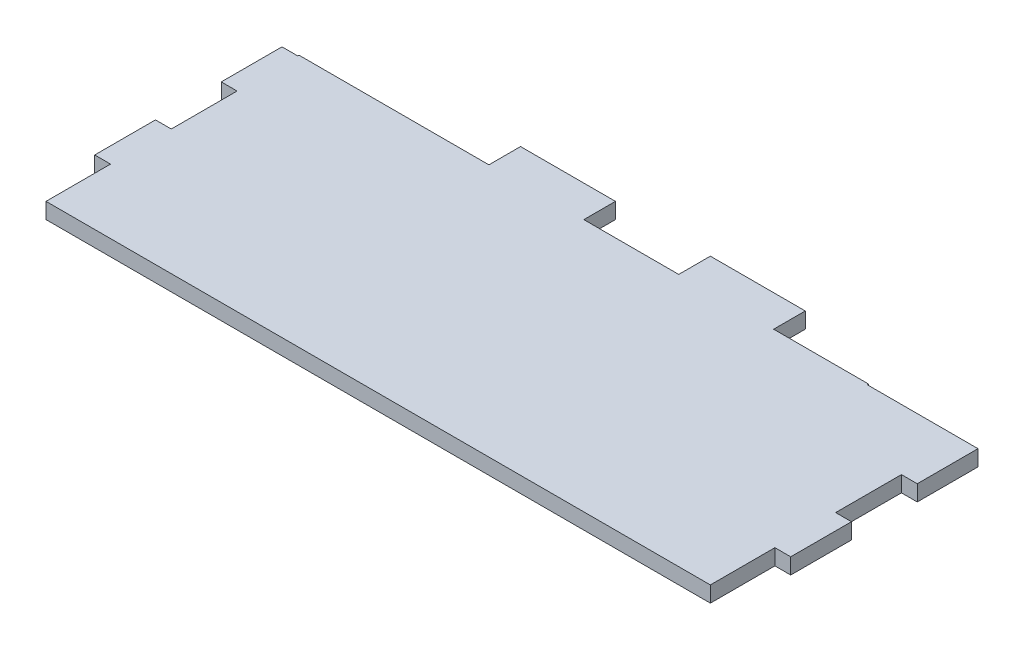
ISO-10303-21;
HEADER;
FILE_DESCRIPTION(('STEP AP214'),'2;1');
FILE_NAME('part.step','',(''),(''),'','','');
FILE_SCHEMA(('AUTOMOTIVE_DESIGN { 1 0 10303 214 1 1 1 1 }'));
ENDSEC;
DATA;
#1=APPLICATION_CONTEXT('core data for automotive mechanical design processes');
#2=APPLICATION_PROTOCOL_DEFINITION('international standard','automotive_design',2000,#1);
#3=PRODUCT_CONTEXT('',#1,'mechanical');
#4=PRODUCT('Part','Part','',(#3));
#5=PRODUCT_RELATED_PRODUCT_CATEGORY('part','',(#4));
#6=PRODUCT_DEFINITION_FORMATION('','',#4);
#7=PRODUCT_DEFINITION_CONTEXT('part definition',#1,'design');
#8=PRODUCT_DEFINITION('design','',#6,#7);
#9=PRODUCT_DEFINITION_SHAPE('','',#8);
#10=(LENGTH_UNIT() NAMED_UNIT(*) SI_UNIT(.MILLI.,.METRE.));
#11=(NAMED_UNIT(*) PLANE_ANGLE_UNIT() SI_UNIT($,.RADIAN.));
#12=(NAMED_UNIT(*) SI_UNIT($,.STERADIAN.) SOLID_ANGLE_UNIT());
#13=UNCERTAINTY_MEASURE_WITH_UNIT(LENGTH_MEASURE(1.E-05),#10,'distance_accuracy_value','');
#14=(GEOMETRIC_REPRESENTATION_CONTEXT(3) GLOBAL_UNCERTAINTY_ASSIGNED_CONTEXT((#13)) GLOBAL_UNIT_ASSIGNED_CONTEXT((#10,
#11,#12)) REPRESENTATION_CONTEXT('',''));
#15=CARTESIAN_POINT('',(0.,0.,0.));
#16=DIRECTION('',(0.,0.,1.));
#17=DIRECTION('',(1.,0.,0.));
#18=AXIS2_PLACEMENT_3D('',#15,#16,#17);
#19=CARTESIAN_POINT('',(0.,3.175,0.));
#20=DIRECTION('',(0.,-1.,0.));
#21=DIRECTION('',(0.,0.,-1.));
#22=AXIS2_PLACEMENT_3D('',#19,#20,#21);
#23=PLANE('',#22);
#24=DIRECTION('',(-1.,0.,0.));
#25=VECTOR('',#24,1.);
#26=CARTESIAN_POINT('',(-97.10973789192,3.175,0.));
#27=LINE('',#26,#25);
#28=CARTESIAN_POINT('',(66.675,3.175,0.));
#29=VERTEX_POINT('',#28);
#30=CARTESIAN_POINT('',(-66.675,3.175,0.));
#31=VERTEX_POINT('',#30);
#32=EDGE_CURVE('E51',#29,#31,#27,.T.);
#33=ORIENTED_EDGE('',*,*,#32,.F.);
#34=DIRECTION('',(0.,0.,-1.));
#35=VECTOR('',#34,1.);
#36=CARTESIAN_POINT('',(66.675,3.175,50.8));
#37=LINE('',#36,#35);
#38=CARTESIAN_POINT('',(66.675,3.175,-12.954));
#39=VERTEX_POINT('',#38);
#40=EDGE_CURVE('E233',#29,#39,#37,.T.);
#41=ORIENTED_EDGE('',*,*,#40,.T.);
#42=DIRECTION('',(-1.,0.,0.));
#43=VECTOR('',#42,1.);
#44=CARTESIAN_POINT('',(66.6749999999998,3.175,-12.954));
#45=LINE('',#44,#43);
#46=CARTESIAN_POINT('',(69.8499999999998,3.175,-12.954));
#47=VERTEX_POINT('',#46);
#48=EDGE_CURVE('E396',#47,#39,#45,.T.);
#49=ORIENTED_EDGE('',*,*,#48,.F.);
#50=DIRECTION('',(0.,0.,1.));
#51=VECTOR('',#50,1.);
#52=CARTESIAN_POINT('',(69.8499999999998,3.175,-12.954));
#53=LINE('',#52,#51);
#54=CARTESIAN_POINT('',(69.8499999999998,3.175,-25.146));
#55=VERTEX_POINT('',#54);
#56=EDGE_CURVE('E388',#55,#47,#53,.T.);
#57=ORIENTED_EDGE('',*,*,#56,.F.);
#58=DIRECTION('',(1.,0.,0.));
#59=VECTOR('',#58,1.);
#60=CARTESIAN_POINT('',(66.6749999999998,3.175,-25.146));
#61=LINE('',#60,#59);
#62=CARTESIAN_POINT('',(66.675,3.175,-25.146));
#63=VERTEX_POINT('',#62);
#64=EDGE_CURVE('E404',#63,#55,#61,.T.);
#65=ORIENTED_EDGE('',*,*,#64,.F.);
#66=CARTESIAN_POINT('',(66.6749999999997,3.175,-38.354));
#67=VERTEX_POINT('',#66);
#68=EDGE_CURVE('E252',#63,#67,#37,.T.);
#69=ORIENTED_EDGE('',*,*,#68,.T.);
#70=DIRECTION('',(-1.,0.,0.));
#71=VECTOR('',#70,1.);
#72=CARTESIAN_POINT('',(66.6749999999997,3.175,-38.354));
#73=LINE('',#72,#71);
#74=CARTESIAN_POINT('',(69.8499999999997,3.175,-38.354));
#75=VERTEX_POINT('',#74);
#76=EDGE_CURVE('E370',#75,#67,#73,.T.);
#77=ORIENTED_EDGE('',*,*,#76,.F.);
#78=DIRECTION('',(0.,0.,1.));
#79=VECTOR('',#78,1.);
#80=CARTESIAN_POINT('',(69.8499999999997,3.175,-38.354));
#81=LINE('',#80,#79);
#82=CARTESIAN_POINT('',(69.8499999999997,3.175,-50.546));
#83=VERTEX_POINT('',#82);
#84=EDGE_CURVE('E364',#83,#75,#81,.T.);
#85=ORIENTED_EDGE('',*,*,#84,.F.);
#86=DIRECTION('',(1.,0.,0.));
#87=VECTOR('',#86,1.);
#88=CARTESIAN_POINT('',(66.6749999999997,3.175,-50.546));
#89=LINE('',#88,#87);
#90=CARTESIAN_POINT('',(47.625,3.175,-50.546));
#91=VERTEX_POINT('',#90);
#92=EDGE_CURVE('E380',#91,#83,#89,.T.);
#93=ORIENTED_EDGE('',*,*,#92,.F.);
#94=DIRECTION('',(0.,0.,1.));
#95=VECTOR('',#94,1.);
#96=CARTESIAN_POINT('',(47.625,3.175,-57.1499999999992));
#97=LINE('',#96,#95);
#98=CARTESIAN_POINT('',(47.625,3.175,-50.7999999999992));
#99=VERTEX_POINT('',#98);
#100=EDGE_CURVE('E464',#99,#91,#97,.T.);
#101=ORIENTED_EDGE('',*,*,#100,.F.);
#102=DIRECTION('',(-1.,0.,0.));
#103=VECTOR('',#102,1.);
#104=CARTESIAN_POINT('',(-66.675,3.175,-50.8));
#105=LINE('',#104,#103);
#106=CARTESIAN_POINT('',(28.575,3.175,-50.8));
#107=VERTEX_POINT('',#106);
#108=EDGE_CURVE('E294',#99,#107,#105,.T.);
#109=ORIENTED_EDGE('',*,*,#108,.T.);
#110=DIRECTION('',(0.,0.,1.));
#111=VECTOR('',#110,1.);
#112=CARTESIAN_POINT('',(28.575,3.175,-50.7999999999995));
#113=LINE('',#112,#111);
#114=CARTESIAN_POINT('',(28.575,3.175,-57.1499999999995));
#115=VERTEX_POINT('',#114);
#116=EDGE_CURVE('E437',#115,#107,#113,.T.);
#117=ORIENTED_EDGE('',*,*,#116,.F.);
#118=DIRECTION('',(1.,0.,0.));
#119=VECTOR('',#118,1.);
#120=CARTESIAN_POINT('',(9.52500000000001,3.175,-57.1499999999995));
#121=LINE('',#120,#119);
#122=CARTESIAN_POINT('',(9.52500000000001,3.175,-57.1499999999995));
#123=VERTEX_POINT('',#122);
#124=EDGE_CURVE('E455',#123,#115,#121,.T.);
#125=ORIENTED_EDGE('',*,*,#124,.F.);
#126=DIRECTION('',(0.,0.,-1.));
#127=VECTOR('',#126,1.);
#128=CARTESIAN_POINT('',(9.52500000000001,3.175,-50.7999999999995));
#129=LINE('',#128,#127);
#130=CARTESIAN_POINT('',(9.52500000000001,3.175,-50.8));
#131=VERTEX_POINT('',#130);
#132=EDGE_CURVE('E446',#131,#123,#129,.T.);
#133=ORIENTED_EDGE('',*,*,#132,.F.);
#134=CARTESIAN_POINT('',(-9.525,3.175,-50.8));
#135=VERTEX_POINT('',#134);
#136=EDGE_CURVE('E59',#131,#135,#105,.T.);
#137=ORIENTED_EDGE('',*,*,#136,.T.);
#138=DIRECTION('',(0.,0.,1.));
#139=VECTOR('',#138,1.);
#140=CARTESIAN_POINT('',(-9.525,3.175,-50.7999999999997));
#141=LINE('',#140,#139);
#142=CARTESIAN_POINT('',(-9.525,3.175,-57.1499999999997));
#143=VERTEX_POINT('',#142);
#144=EDGE_CURVE('E412',#143,#135,#141,.T.);
#145=ORIENTED_EDGE('',*,*,#144,.F.);
#146=DIRECTION('',(1.,0.,0.));
#147=VECTOR('',#146,1.);
#148=CARTESIAN_POINT('',(-28.575,3.175,-57.1499999999997));
#149=LINE('',#148,#147);
#150=CARTESIAN_POINT('',(-28.575,3.175,-57.1499999999997));
#151=VERTEX_POINT('',#150);
#152=EDGE_CURVE('E430',#151,#143,#149,.T.);
#153=ORIENTED_EDGE('',*,*,#152,.F.);
#154=DIRECTION('',(0.,0.,-1.));
#155=VECTOR('',#154,1.);
#156=CARTESIAN_POINT('',(-28.575,3.175,-50.7999999999997));
#157=LINE('',#156,#155);
#158=CARTESIAN_POINT('',(-28.575,3.175,-50.8));
#159=VERTEX_POINT('',#158);
#160=EDGE_CURVE('E308',#159,#151,#157,.T.);
#161=ORIENTED_EDGE('',*,*,#160,.F.);
#162=CARTESIAN_POINT('',(-66.675,3.175,-50.8));
#163=VERTEX_POINT('',#162);
#164=EDGE_CURVE('E293',#159,#163,#105,.T.);
#165=ORIENTED_EDGE('',*,*,#164,.T.);
#166=DIRECTION('',(0.,0.,1.));
#167=VECTOR('',#166,1.);
#168=CARTESIAN_POINT('',(-66.675,3.175,50.8));
#169=LINE('',#168,#167);
#170=CARTESIAN_POINT('',(-66.675,3.175,-50.546));
#171=VERTEX_POINT('',#170);
#172=EDGE_CURVE('E45',#163,#171,#169,.T.);
#173=ORIENTED_EDGE('',*,*,#172,.T.);
#174=DIRECTION('',(1.,0.,0.));
#175=VECTOR('',#174,1.);
#176=CARTESIAN_POINT('',(-66.6749999999997,3.175,-50.546));
#177=LINE('',#176,#175);
#178=CARTESIAN_POINT('',(-69.8499999999997,3.175,-50.546));
#179=VERTEX_POINT('',#178);
#180=EDGE_CURVE('E342',#179,#171,#177,.T.);
#181=ORIENTED_EDGE('',*,*,#180,.F.);
#182=DIRECTION('',(0.,0.,-1.));
#183=VECTOR('',#182,1.);
#184=CARTESIAN_POINT('',(-69.8499999999997,3.175,-38.354));
#185=LINE('',#184,#183);
#186=CARTESIAN_POINT('',(-69.8499999999997,3.175,-38.354));
#187=VERTEX_POINT('',#186);
#188=EDGE_CURVE('E356',#187,#179,#185,.T.);
#189=ORIENTED_EDGE('',*,*,#188,.F.);
#190=DIRECTION('',(-1.,0.,0.));
#191=VECTOR('',#190,1.);
#192=CARTESIAN_POINT('',(-66.6749999999997,3.175,-38.354));
#193=LINE('',#192,#191);
#194=CARTESIAN_POINT('',(-66.675,3.175,-38.354));
#195=VERTEX_POINT('',#194);
#196=EDGE_CURVE('E326',#195,#187,#193,.T.);
#197=ORIENTED_EDGE('',*,*,#196,.F.);
#198=CARTESIAN_POINT('',(-66.675,3.175,-25.146));
#199=VERTEX_POINT('',#198);
#200=EDGE_CURVE('E301',#195,#199,#169,.T.);
#201=ORIENTED_EDGE('',*,*,#200,.T.);
#202=DIRECTION('',(1.,0.,0.));
#203=VECTOR('',#202,1.);
#204=CARTESIAN_POINT('',(-66.6749999999998,3.175,-25.146));
#205=LINE('',#204,#203);
#206=CARTESIAN_POINT('',(-69.8499999999998,3.175,-25.146));
#207=VERTEX_POINT('',#206);
#208=EDGE_CURVE('E282',#207,#199,#205,.T.);
#209=ORIENTED_EDGE('',*,*,#208,.F.);
#210=DIRECTION('',(0.,0.,-1.));
#211=VECTOR('',#210,1.);
#212=CARTESIAN_POINT('',(-69.8499999999998,3.175,-12.954));
#213=LINE('',#212,#211);
#214=CARTESIAN_POINT('',(-69.8499999999998,3.175,-12.954));
#215=VERTEX_POINT('',#214);
#216=EDGE_CURVE('E334',#215,#207,#213,.T.);
#217=ORIENTED_EDGE('',*,*,#216,.F.);
#218=DIRECTION('',(-1.,0.,0.));
#219=VECTOR('',#218,1.);
#220=CARTESIAN_POINT('',(-66.6749999999998,3.175,-12.954));
#221=LINE('',#220,#219);
#222=CARTESIAN_POINT('',(-66.675,3.175,-12.954));
#223=VERTEX_POINT('',#222);
#224=EDGE_CURVE('E286',#223,#215,#221,.T.);
#225=ORIENTED_EDGE('',*,*,#224,.F.);
#226=EDGE_CURVE('E295',#223,#31,#169,.T.);
#227=ORIENTED_EDGE('',*,*,#226,.T.);
#228=EDGE_LOOP('',(#33,#41,#49,#57,#65,#69,#77,#85,#93,#101,#109,#117,#125,#133,#137,#145,#153,
#161,#165,#173,#181,#189,#197,#201,#209,#217,#225,#227));
#229=FACE_BOUND('',#228,.T.);
#230=ADVANCED_FACE('F37',(#229),#23,.F.);
#231=CARTESIAN_POINT('',(0.,0.,0.));
#232=DIRECTION('',(0.,-1.,0.));
#233=DIRECTION('',(0.,0.,-1.));
#234=AXIS2_PLACEMENT_3D('',#231,#232,#233);
#235=PLANE('',#234);
#236=DIRECTION('',(0.,0.,-1.));
#237=VECTOR('',#236,1.);
#238=CARTESIAN_POINT('',(66.675,0.,50.8));
#239=LINE('',#238,#237);
#240=CARTESIAN_POINT('',(66.675,0.,0.));
#241=VERTEX_POINT('',#240);
#242=CARTESIAN_POINT('',(66.675,0.,-12.954));
#243=VERTEX_POINT('',#242);
#244=EDGE_CURVE('E231',#241,#243,#239,.T.);
#245=ORIENTED_EDGE('',*,*,#244,.F.);
#246=DIRECTION('',(-1.,0.,0.));
#247=VECTOR('',#246,1.);
#248=CARTESIAN_POINT('',(-97.10973789192,0.,0.));
#249=LINE('',#248,#247);
#250=CARTESIAN_POINT('',(-66.675,0.,0.));
#251=VERTEX_POINT('',#250);
#252=EDGE_CURVE('E220',#241,#251,#249,.T.);
#253=ORIENTED_EDGE('',*,*,#252,.T.);
#254=DIRECTION('',(0.,0.,1.));
#255=VECTOR('',#254,1.);
#256=CARTESIAN_POINT('',(-66.675,0.,50.8));
#257=LINE('',#256,#255);
#258=CARTESIAN_POINT('',(-66.6749999999998,0.,-12.954));
#259=VERTEX_POINT('',#258);
#260=EDGE_CURVE('E250',#259,#251,#257,.T.);
#261=ORIENTED_EDGE('',*,*,#260,.F.);
#262=DIRECTION('',(-1.,0.,0.));
#263=VECTOR('',#262,1.);
#264=CARTESIAN_POINT('',(-66.6749999999998,0.,-12.954));
#265=LINE('',#264,#263);
#266=CARTESIAN_POINT('',(-69.8499999999998,0.,-12.954));
#267=VERTEX_POINT('',#266);
#268=EDGE_CURVE('E269',#259,#267,#265,.T.);
#269=ORIENTED_EDGE('',*,*,#268,.T.);
#270=DIRECTION('',(0.,0.,-1.));
#271=VECTOR('',#270,1.);
#272=CARTESIAN_POINT('',(-69.8499999999998,0.,-12.954));
#273=LINE('',#272,#271);
#274=CARTESIAN_POINT('',(-69.8499999999998,0.,-25.146));
#275=VERTEX_POINT('',#274);
#276=EDGE_CURVE('E272',#267,#275,#273,.T.);
#277=ORIENTED_EDGE('',*,*,#276,.T.);
#278=DIRECTION('',(1.,0.,0.));
#279=VECTOR('',#278,1.);
#280=CARTESIAN_POINT('',(-66.6749999999998,0.,-25.146));
#281=LINE('',#280,#279);
#282=CARTESIAN_POINT('',(-66.675,0.,-25.146));
#283=VERTEX_POINT('',#282);
#284=EDGE_CURVE('E277',#275,#283,#281,.T.);
#285=ORIENTED_EDGE('',*,*,#284,.T.);
#286=CARTESIAN_POINT('',(-66.6749999999997,0.,-38.354));
#287=VERTEX_POINT('',#286);
#288=EDGE_CURVE('E253',#287,#283,#257,.T.);
#289=ORIENTED_EDGE('',*,*,#288,.F.);
#290=DIRECTION('',(-1.,0.,0.));
#291=VECTOR('',#290,1.);
#292=CARTESIAN_POINT('',(-66.6749999999997,0.,-38.354));
#293=LINE('',#292,#291);
#294=CARTESIAN_POINT('',(-69.8499999999997,0.,-38.354));
#295=VERTEX_POINT('',#294);
#296=EDGE_CURVE('E351',#287,#295,#293,.T.);
#297=ORIENTED_EDGE('',*,*,#296,.T.);
#298=DIRECTION('',(0.,0.,-1.));
#299=VECTOR('',#298,1.);
#300=CARTESIAN_POINT('',(-69.8499999999997,0.,-38.354));
#301=LINE('',#300,#299);
#302=CARTESIAN_POINT('',(-69.8499999999997,0.,-50.546));
#303=VERTEX_POINT('',#302);
#304=EDGE_CURVE('E348',#295,#303,#301,.T.);
#305=ORIENTED_EDGE('',*,*,#304,.T.);
#306=DIRECTION('',(1.,0.,0.));
#307=VECTOR('',#306,1.);
#308=CARTESIAN_POINT('',(-66.6749999999997,0.,-50.546));
#309=LINE('',#308,#307);
#310=CARTESIAN_POINT('',(-66.675,0.,-50.546));
#311=VERTEX_POINT('',#310);
#312=EDGE_CURVE('E345',#303,#311,#309,.T.);
#313=ORIENTED_EDGE('',*,*,#312,.T.);
#314=CARTESIAN_POINT('',(-66.675,0.,-50.8));
#315=VERTEX_POINT('',#314);
#316=EDGE_CURVE('E251',#315,#311,#257,.T.);
#317=ORIENTED_EDGE('',*,*,#316,.F.);
#318=DIRECTION('',(-1.,0.,0.));
#319=VECTOR('',#318,1.);
#320=CARTESIAN_POINT('',(-66.675,0.,-50.8));
#321=LINE('',#320,#319);
#322=CARTESIAN_POINT('',(-28.575,0.,-50.7999999999997));
#323=VERTEX_POINT('',#322);
#324=EDGE_CURVE('E241',#323,#315,#321,.T.);
#325=ORIENTED_EDGE('',*,*,#324,.F.);
#326=DIRECTION('',(0.,0.,-1.));
#327=VECTOR('',#326,1.);
#328=CARTESIAN_POINT('',(-28.575,0.,-50.7999999999997));
#329=LINE('',#328,#327);
#330=CARTESIAN_POINT('',(-28.575,0.,-57.1499999999997));
#331=VERTEX_POINT('',#330);
#332=EDGE_CURVE('E424',#323,#331,#329,.T.);
#333=ORIENTED_EDGE('',*,*,#332,.T.);
#334=DIRECTION('',(1.,0.,0.));
#335=VECTOR('',#334,1.);
#336=CARTESIAN_POINT('',(-28.575,0.,-57.1499999999997));
#337=LINE('',#336,#335);
#338=CARTESIAN_POINT('',(-9.525,0.,-57.1499999999997));
#339=VERTEX_POINT('',#338);
#340=EDGE_CURVE('E421',#331,#339,#337,.T.);
#341=ORIENTED_EDGE('',*,*,#340,.T.);
#342=DIRECTION('',(0.,0.,1.));
#343=VECTOR('',#342,1.);
#344=CARTESIAN_POINT('',(-9.525,0.,-50.7999999999997));
#345=LINE('',#344,#343);
#346=CARTESIAN_POINT('',(-9.525,0.,-50.8));
#347=VERTEX_POINT('',#346);
#348=EDGE_CURVE('E418',#339,#347,#345,.T.);
#349=ORIENTED_EDGE('',*,*,#348,.T.);
#350=CARTESIAN_POINT('',(9.52500000000001,0.,-50.7999999999995));
#351=VERTEX_POINT('',#350);
#352=EDGE_CURVE('E244',#351,#347,#321,.T.);
#353=ORIENTED_EDGE('',*,*,#352,.F.);
#354=DIRECTION('',(0.,0.,-1.));
#355=VECTOR('',#354,1.);
#356=CARTESIAN_POINT('',(9.52500000000001,0.,-50.7999999999995));
#357=LINE('',#356,#355);
#358=CARTESIAN_POINT('',(9.52500000000001,0.,-57.1499999999995));
#359=VERTEX_POINT('',#358);
#360=EDGE_CURVE('E450',#351,#359,#357,.T.);
#361=ORIENTED_EDGE('',*,*,#360,.T.);
#362=DIRECTION('',(1.,0.,0.));
#363=VECTOR('',#362,1.);
#364=CARTESIAN_POINT('',(9.52500000000001,0.,-57.1499999999995));
#365=LINE('',#364,#363);
#366=CARTESIAN_POINT('',(28.575,0.,-57.1499999999995));
#367=VERTEX_POINT('',#366);
#368=EDGE_CURVE('E447',#359,#367,#365,.T.);
#369=ORIENTED_EDGE('',*,*,#368,.T.);
#370=DIRECTION('',(0.,0.,1.));
#371=VECTOR('',#370,1.);
#372=CARTESIAN_POINT('',(28.575,0.,-50.7999999999995));
#373=LINE('',#372,#371);
#374=CARTESIAN_POINT('',(28.575,0.,-50.8));
#375=VERTEX_POINT('',#374);
#376=EDGE_CURVE('E443',#367,#375,#373,.T.);
#377=ORIENTED_EDGE('',*,*,#376,.T.);
#378=CARTESIAN_POINT('',(47.625,0.,-50.7999999999992));
#379=VERTEX_POINT('',#378);
#380=EDGE_CURVE('E246',#379,#375,#321,.T.);
#381=ORIENTED_EDGE('',*,*,#380,.F.);
#382=DIRECTION('',(0.,0.,1.));
#383=VECTOR('',#382,1.);
#384=CARTESIAN_POINT('',(47.625,0.,-57.1499999999992));
#385=LINE('',#384,#383);
#386=CARTESIAN_POINT('',(47.625,0.,-50.546));
#387=VERTEX_POINT('',#386);
#388=EDGE_CURVE('E234',#379,#387,#385,.T.);
#389=ORIENTED_EDGE('',*,*,#388,.T.);
#390=DIRECTION('',(1.,0.,0.));
#391=VECTOR('',#390,1.);
#392=CARTESIAN_POINT('',(66.6749999999997,0.,-50.546));
#393=LINE('',#392,#391);
#394=CARTESIAN_POINT('',(69.8499999999997,0.,-50.546));
#395=VERTEX_POINT('',#394);
#396=EDGE_CURVE('E371',#387,#395,#393,.T.);
#397=ORIENTED_EDGE('',*,*,#396,.T.);
#398=DIRECTION('',(0.,0.,1.));
#399=VECTOR('',#398,1.);
#400=CARTESIAN_POINT('',(69.8499999999997,0.,-38.354));
#401=LINE('',#400,#399);
#402=CARTESIAN_POINT('',(69.8499999999997,0.,-38.354));
#403=VERTEX_POINT('',#402);
#404=EDGE_CURVE('E367',#395,#403,#401,.T.);
#405=ORIENTED_EDGE('',*,*,#404,.T.);
#406=DIRECTION('',(-1.,0.,0.));
#407=VECTOR('',#406,1.);
#408=CARTESIAN_POINT('',(66.6749999999997,0.,-38.354));
#409=LINE('',#408,#407);
#410=CARTESIAN_POINT('',(66.6749999999997,0.,-38.354));
#411=VERTEX_POINT('',#410);
#412=EDGE_CURVE('E374',#403,#411,#409,.T.);
#413=ORIENTED_EDGE('',*,*,#412,.T.);
#414=CARTESIAN_POINT('',(66.6749999999998,0.,-25.146));
#415=VERTEX_POINT('',#414);
#416=EDGE_CURVE('E242',#415,#411,#239,.T.);
#417=ORIENTED_EDGE('',*,*,#416,.F.);
#418=DIRECTION('',(1.,0.,0.));
#419=VECTOR('',#418,1.);
#420=CARTESIAN_POINT('',(66.6749999999998,0.,-25.146));
#421=LINE('',#420,#419);
#422=CARTESIAN_POINT('',(69.8499999999998,0.,-25.146));
#423=VERTEX_POINT('',#422);
#424=EDGE_CURVE('E397',#415,#423,#421,.T.);
#425=ORIENTED_EDGE('',*,*,#424,.T.);
#426=DIRECTION('',(0.,0.,1.));
#427=VECTOR('',#426,1.);
#428=CARTESIAN_POINT('',(69.8499999999998,0.,-12.954));
#429=LINE('',#428,#427);
#430=CARTESIAN_POINT('',(69.8499999999998,0.,-12.954));
#431=VERTEX_POINT('',#430);
#432=EDGE_CURVE('E394',#423,#431,#429,.T.);
#433=ORIENTED_EDGE('',*,*,#432,.T.);
#434=DIRECTION('',(-1.,0.,0.));
#435=VECTOR('',#434,1.);
#436=CARTESIAN_POINT('',(66.6749999999998,0.,-12.954));
#437=LINE('',#436,#435);
#438=EDGE_CURVE('E240',#431,#243,#437,.T.);
#439=ORIENTED_EDGE('',*,*,#438,.T.);
#440=EDGE_LOOP('',(#245,#253,#261,#269,#277,#285,#289,#297,#305,#313,#317,#325,#333,#341,#349,
#353,#361,#369,#377,#381,#389,#397,#405,#413,#417,#425,#433,#439));
#441=FACE_BOUND('',#440,.T.);
#442=ADVANCED_FACE('F237',(#441),#235,.T.);
#443=CARTESIAN_POINT('',(66.675,3.175,50.8));
#444=DIRECTION('',(-1.,0.,0.));
#445=DIRECTION('',(0.,0.,1.));
#446=AXIS2_PLACEMENT_3D('',#443,#444,#445);
#447=PLANE('',#446);
#448=DIRECTION('',(0.,1.,0.));
#449=VECTOR('',#448,1.);
#450=CARTESIAN_POINT('',(66.675,3.175,0.));
#451=LINE('',#450,#449);
#452=EDGE_CURVE('E223',#241,#29,#451,.T.);
#453=ORIENTED_EDGE('',*,*,#452,.F.);
#454=ORIENTED_EDGE('',*,*,#244,.T.);
#455=DIRECTION('',(0.,-1.,0.));
#456=VECTOR('',#455,1.);
#457=CARTESIAN_POINT('',(66.6749999999998,3.175,-12.954));
#458=LINE('',#457,#456);
#459=EDGE_CURVE('E385',#39,#243,#458,.T.);
#460=ORIENTED_EDGE('',*,*,#459,.F.);
#461=ORIENTED_EDGE('',*,*,#40,.F.);
#462=EDGE_LOOP('',(#453,#454,#460,#461));
#463=FACE_BOUND('',#462,.T.);
#464=ADVANCED_FACE('F39',(#463),#447,.F.);
#465=CARTESIAN_POINT('',(-66.675,3.175,50.8));
#466=DIRECTION('',(1.,0.,0.));
#467=DIRECTION('',(0.,0.,-1.));
#468=AXIS2_PLACEMENT_3D('',#465,#466,#467);
#469=PLANE('',#468);
#470=DIRECTION('',(0.,-1.,0.));
#471=VECTOR('',#470,1.);
#472=CARTESIAN_POINT('',(-66.675,3.175,0.));
#473=LINE('',#472,#471);
#474=EDGE_CURVE('E12',#31,#251,#473,.T.);
#475=ORIENTED_EDGE('',*,*,#474,.F.);
#476=ORIENTED_EDGE('',*,*,#226,.F.);
#477=DIRECTION('',(0.,-1.,0.));
#478=VECTOR('',#477,1.);
#479=CARTESIAN_POINT('',(-66.6749999999998,3.175,-12.954));
#480=LINE('',#479,#478);
#481=EDGE_CURVE('E265',#223,#259,#480,.T.);
#482=ORIENTED_EDGE('',*,*,#481,.T.);
#483=ORIENTED_EDGE('',*,*,#260,.T.);
#484=EDGE_LOOP('',(#475,#476,#482,#483));
#485=FACE_BOUND('',#484,.T.);
#486=ADVANCED_FACE('F262',(#485),#469,.F.);
#487=DIRECTION('',(0.,-1.,0.));
#488=VECTOR('',#487,1.);
#489=CARTESIAN_POINT('',(-66.675,3.175,-50.8));
#490=LINE('',#489,#488);
#491=EDGE_CURVE('E312',#163,#315,#490,.T.);
#492=ORIENTED_EDGE('',*,*,#491,.T.);
#493=ORIENTED_EDGE('',*,*,#316,.T.);
#494=DIRECTION('',(0.,-1.,0.));
#495=VECTOR('',#494,1.);
#496=CARTESIAN_POINT('',(-66.6749999999997,3.175,-50.546));
#497=LINE('',#496,#495);
#498=EDGE_CURVE('E275',#171,#311,#497,.T.);
#499=ORIENTED_EDGE('',*,*,#498,.F.);
#500=ORIENTED_EDGE('',*,*,#172,.F.);
#501=EDGE_LOOP('',(#492,#493,#499,#500));
#502=FACE_BOUND('',#501,.T.);
#503=ADVANCED_FACE('F317',(#502),#469,.F.);
#504=CARTESIAN_POINT('',(-66.675,3.175,-50.8));
#505=DIRECTION('',(0.,0.,1.));
#506=DIRECTION('',(1.,0.,0.));
#507=AXIS2_PLACEMENT_3D('',#504,#505,#506);
#508=PLANE('',#507);
#509=ORIENTED_EDGE('',*,*,#136,.F.);
#510=DIRECTION('',(0.,-1.,0.));
#511=VECTOR('',#510,1.);
#512=CARTESIAN_POINT('',(9.52500000000001,3.175,-50.7999999999995));
#513=LINE('',#512,#511);
#514=EDGE_CURVE('E427',#131,#351,#513,.T.);
#515=ORIENTED_EDGE('',*,*,#514,.T.);
#516=ORIENTED_EDGE('',*,*,#352,.T.);
#517=DIRECTION('',(0.,-1.,0.));
#518=VECTOR('',#517,1.);
#519=CARTESIAN_POINT('',(-9.525,3.175,-50.7999999999997));
#520=LINE('',#519,#518);
#521=EDGE_CURVE('E414',#135,#347,#520,.T.);
#522=ORIENTED_EDGE('',*,*,#521,.F.);
#523=EDGE_LOOP('',(#509,#515,#516,#522));
#524=FACE_BOUND('',#523,.T.);
#525=ADVANCED_FACE('F522',(#524),#508,.F.);
#526=ORIENTED_EDGE('',*,*,#164,.F.);
#527=DIRECTION('',(0.,-1.,0.));
#528=VECTOR('',#527,1.);
#529=CARTESIAN_POINT('',(-28.575,3.175,-50.7999999999997));
#530=LINE('',#529,#528);
#531=EDGE_CURVE('E401',#159,#323,#530,.T.);
#532=ORIENTED_EDGE('',*,*,#531,.T.);
#533=ORIENTED_EDGE('',*,*,#324,.T.);
#534=ORIENTED_EDGE('',*,*,#491,.F.);
#535=EDGE_LOOP('',(#526,#532,#533,#534));
#536=FACE_BOUND('',#535,.T.);
#537=ADVANCED_FACE('F313',(#536),#508,.F.);
#538=ORIENTED_EDGE('',*,*,#108,.F.);
#539=DIRECTION('',(0.,-1.,0.));
#540=VECTOR('',#539,1.);
#541=CARTESIAN_POINT('',(47.625,3.175,-50.7999999999992));
#542=LINE('',#541,#540);
#543=EDGE_CURVE('E314',#99,#379,#542,.T.);
#544=ORIENTED_EDGE('',*,*,#543,.T.);
#545=ORIENTED_EDGE('',*,*,#380,.T.);
#546=DIRECTION('',(0.,-1.,0.));
#547=VECTOR('',#546,1.);
#548=CARTESIAN_POINT('',(28.575,3.175,-50.7999999999995));
#549=LINE('',#548,#547);
#550=EDGE_CURVE('E439',#107,#375,#549,.T.);
#551=ORIENTED_EDGE('',*,*,#550,.F.);
#552=EDGE_LOOP('',(#538,#544,#545,#551));
#553=FACE_BOUND('',#552,.T.);
#554=ADVANCED_FACE('F519',(#553),#508,.F.);
#555=ORIENTED_EDGE('',*,*,#68,.F.);
#556=DIRECTION('',(0.,-1.,0.));
#557=VECTOR('',#556,1.);
#558=CARTESIAN_POINT('',(66.6749999999998,3.175,-25.146));
#559=LINE('',#558,#557);
#560=EDGE_CURVE('E387',#63,#415,#559,.T.);
#561=ORIENTED_EDGE('',*,*,#560,.T.);
#562=ORIENTED_EDGE('',*,*,#416,.T.);
#563=DIRECTION('',(0.,-1.,0.));
#564=VECTOR('',#563,1.);
#565=CARTESIAN_POINT('',(66.6749999999997,3.175,-38.354));
#566=LINE('',#565,#564);
#567=EDGE_CURVE('E360',#67,#411,#566,.T.);
#568=ORIENTED_EDGE('',*,*,#567,.F.);
#569=EDGE_LOOP('',(#555,#561,#562,#568));
#570=FACE_BOUND('',#569,.T.);
#571=ADVANCED_FACE('F488',(#570),#447,.F.);
#572=ORIENTED_EDGE('',*,*,#200,.F.);
#573=DIRECTION('',(0.,-1.,0.));
#574=VECTOR('',#573,1.);
#575=CARTESIAN_POINT('',(-66.6749999999997,3.175,-38.354));
#576=LINE('',#575,#574);
#577=EDGE_CURVE('E339',#195,#287,#576,.T.);
#578=ORIENTED_EDGE('',*,*,#577,.T.);
#579=ORIENTED_EDGE('',*,*,#288,.T.);
#580=DIRECTION('',(0.,-1.,0.));
#581=VECTOR('',#580,1.);
#582=CARTESIAN_POINT('',(-66.6749999999998,3.175,-25.146));
#583=LINE('',#582,#581);
#584=EDGE_CURVE('E247',#199,#283,#583,.T.);
#585=ORIENTED_EDGE('',*,*,#584,.F.);
#586=EDGE_LOOP('',(#572,#578,#579,#585));
#587=FACE_BOUND('',#586,.T.);
#588=ADVANCED_FACE('F330',(#587),#469,.F.);
#589=CARTESIAN_POINT('',(-66.6749999999998,3.175,-25.146));
#590=DIRECTION('',(0.,0.,-1.));
#591=DIRECTION('',(-1.,0.,0.));
#592=AXIS2_PLACEMENT_3D('',#589,#590,#591);
#593=PLANE('',#592);
#594=ORIENTED_EDGE('',*,*,#284,.F.);
#595=DIRECTION('',(0.,-1.,0.));
#596=VECTOR('',#595,1.);
#597=CARTESIAN_POINT('',(-69.8499999999998,3.175,-25.146));
#598=LINE('',#597,#596);
#599=EDGE_CURVE('E289',#207,#275,#598,.T.);
#600=ORIENTED_EDGE('',*,*,#599,.F.);
#601=ORIENTED_EDGE('',*,*,#208,.T.);
#602=ORIENTED_EDGE('',*,*,#584,.T.);
#603=EDGE_LOOP('',(#594,#600,#601,#602));
#604=FACE_BOUND('',#603,.T.);
#605=ADVANCED_FACE('F332',(#604),#593,.T.);
#606=CARTESIAN_POINT('',(-69.8499999999998,3.175,-12.954));
#607=DIRECTION('',(-1.,0.,0.));
#608=DIRECTION('',(0.,0.,1.));
#609=AXIS2_PLACEMENT_3D('',#606,#607,#608);
#610=PLANE('',#609);
#611=ORIENTED_EDGE('',*,*,#276,.F.);
#612=DIRECTION('',(0.,-1.,0.));
#613=VECTOR('',#612,1.);
#614=CARTESIAN_POINT('',(-69.8499999999998,3.175,-12.954));
#615=LINE('',#614,#613);
#616=EDGE_CURVE('E291',#215,#267,#615,.T.);
#617=ORIENTED_EDGE('',*,*,#616,.F.);
#618=ORIENTED_EDGE('',*,*,#216,.T.);
#619=ORIENTED_EDGE('',*,*,#599,.T.);
#620=EDGE_LOOP('',(#611,#617,#618,#619));
#621=FACE_BOUND('',#620,.T.);
#622=ADVANCED_FACE('F500',(#621),#610,.T.);
#623=CARTESIAN_POINT('',(-66.6749999999998,3.175,-12.954));
#624=DIRECTION('',(0.,0.,1.));
#625=DIRECTION('',(1.,0.,0.));
#626=AXIS2_PLACEMENT_3D('',#623,#624,#625);
#627=PLANE('',#626);
#628=ORIENTED_EDGE('',*,*,#268,.F.);
#629=ORIENTED_EDGE('',*,*,#481,.F.);
#630=ORIENTED_EDGE('',*,*,#224,.T.);
#631=ORIENTED_EDGE('',*,*,#616,.T.);
#632=EDGE_LOOP('',(#628,#629,#630,#631));
#633=FACE_BOUND('',#632,.T.);
#634=ADVANCED_FACE('F499',(#633),#627,.T.);
#635=CARTESIAN_POINT('',(-66.6749999999997,3.175,-50.546));
#636=DIRECTION('',(0.,0.,-1.));
#637=DIRECTION('',(-1.,0.,0.));
#638=AXIS2_PLACEMENT_3D('',#635,#636,#637);
#639=PLANE('',#638);
#640=ORIENTED_EDGE('',*,*,#312,.F.);
#641=DIRECTION('',(0.,-1.,0.));
#642=VECTOR('',#641,1.);
#643=CARTESIAN_POINT('',(-69.8499999999997,3.175,-50.546));
#644=LINE('',#643,#642);
#645=EDGE_CURVE('E279',#179,#303,#644,.T.);
#646=ORIENTED_EDGE('',*,*,#645,.F.);
#647=ORIENTED_EDGE('',*,*,#180,.T.);
#648=ORIENTED_EDGE('',*,*,#498,.T.);
#649=EDGE_LOOP('',(#640,#646,#647,#648));
#650=FACE_BOUND('',#649,.T.);
#651=ADVANCED_FACE('F507',(#650),#639,.T.);
#652=CARTESIAN_POINT('',(-69.8499999999997,3.175,-38.354));
#653=DIRECTION('',(-1.,0.,0.));
#654=DIRECTION('',(0.,0.,1.));
#655=AXIS2_PLACEMENT_3D('',#652,#653,#654);
#656=PLANE('',#655);
#657=ORIENTED_EDGE('',*,*,#304,.F.);
#658=DIRECTION('',(0.,-1.,0.));
#659=VECTOR('',#658,1.);
#660=CARTESIAN_POINT('',(-69.8499999999997,3.175,-38.354));
#661=LINE('',#660,#659);
#662=EDGE_CURVE('E341',#187,#295,#661,.T.);
#663=ORIENTED_EDGE('',*,*,#662,.F.);
#664=ORIENTED_EDGE('',*,*,#188,.T.);
#665=ORIENTED_EDGE('',*,*,#645,.T.);
#666=EDGE_LOOP('',(#657,#663,#664,#665));
#667=FACE_BOUND('',#666,.T.);
#668=ADVANCED_FACE('F562',(#667),#656,.T.);
#669=CARTESIAN_POINT('',(-66.6749999999997,3.175,-38.354));
#670=DIRECTION('',(0.,0.,1.));
#671=DIRECTION('',(1.,0.,0.));
#672=AXIS2_PLACEMENT_3D('',#669,#670,#671);
#673=PLANE('',#672);
#674=ORIENTED_EDGE('',*,*,#296,.F.);
#675=ORIENTED_EDGE('',*,*,#577,.F.);
#676=ORIENTED_EDGE('',*,*,#196,.T.);
#677=ORIENTED_EDGE('',*,*,#662,.T.);
#678=EDGE_LOOP('',(#674,#675,#676,#677));
#679=FACE_BOUND('',#678,.T.);
#680=ADVANCED_FACE('F572',(#679),#673,.T.);
#681=CARTESIAN_POINT('',(66.6749999999997,3.175,-38.354));
#682=DIRECTION('',(0.,0.,1.));
#683=DIRECTION('',(1.,0.,0.));
#684=AXIS2_PLACEMENT_3D('',#681,#682,#683);
#685=PLANE('',#684);
#686=ORIENTED_EDGE('',*,*,#412,.F.);
#687=DIRECTION('',(0.,-1.,0.));
#688=VECTOR('',#687,1.);
#689=CARTESIAN_POINT('',(69.8499999999997,3.175,-38.354));
#690=LINE('',#689,#688);
#691=EDGE_CURVE('E354',#75,#403,#690,.T.);
#692=ORIENTED_EDGE('',*,*,#691,.F.);
#693=ORIENTED_EDGE('',*,*,#76,.T.);
#694=ORIENTED_EDGE('',*,*,#567,.T.);
#695=EDGE_LOOP('',(#686,#692,#693,#694));
#696=FACE_BOUND('',#695,.T.);
#697=ADVANCED_FACE('F482',(#696),#685,.T.);
#698=CARTESIAN_POINT('',(69.8499999999997,3.175,-38.354));
#699=DIRECTION('',(1.,0.,0.));
#700=DIRECTION('',(0.,0.,-1.));
#701=AXIS2_PLACEMENT_3D('',#698,#699,#700);
#702=PLANE('',#701);
#703=ORIENTED_EDGE('',*,*,#404,.F.);
#704=DIRECTION('',(0.,-1.,0.));
#705=VECTOR('',#704,1.);
#706=CARTESIAN_POINT('',(69.8499999999997,3.175,-50.546));
#707=LINE('',#706,#705);
#708=EDGE_CURVE('E363',#83,#395,#707,.T.);
#709=ORIENTED_EDGE('',*,*,#708,.F.);
#710=ORIENTED_EDGE('',*,*,#84,.T.);
#711=ORIENTED_EDGE('',*,*,#691,.T.);
#712=EDGE_LOOP('',(#703,#709,#710,#711));
#713=FACE_BOUND('',#712,.T.);
#714=ADVANCED_FACE('F478',(#713),#702,.T.);
#715=CARTESIAN_POINT('',(66.6749999999997,3.175,-50.546));
#716=DIRECTION('',(0.,0.,-1.));
#717=DIRECTION('',(-1.,0.,0.));
#718=AXIS2_PLACEMENT_3D('',#715,#716,#717);
#719=PLANE('',#718);
#720=ORIENTED_EDGE('',*,*,#396,.F.);
#721=DIRECTION('',(0.,-1.,0.));
#722=VECTOR('',#721,1.);
#723=CARTESIAN_POINT('',(47.625,3.175,-50.546));
#724=LINE('',#723,#722);
#725=EDGE_CURVE('E315',#91,#387,#724,.T.);
#726=ORIENTED_EDGE('',*,*,#725,.F.);
#727=ORIENTED_EDGE('',*,*,#92,.T.);
#728=ORIENTED_EDGE('',*,*,#708,.T.);
#729=EDGE_LOOP('',(#720,#726,#727,#728));
#730=FACE_BOUND('',#729,.T.);
#731=ADVANCED_FACE('F473',(#730),#719,.T.);
#732=CARTESIAN_POINT('',(66.6749999999998,3.175,-12.954));
#733=DIRECTION('',(0.,0.,1.));
#734=DIRECTION('',(1.,0.,0.));
#735=AXIS2_PLACEMENT_3D('',#732,#733,#734);
#736=PLANE('',#735);
#737=ORIENTED_EDGE('',*,*,#438,.F.);
#738=DIRECTION('',(0.,-1.,0.));
#739=VECTOR('',#738,1.);
#740=CARTESIAN_POINT('',(69.8499999999998,3.175,-12.954));
#741=LINE('',#740,#739);
#742=EDGE_CURVE('E377',#47,#431,#741,.T.);
#743=ORIENTED_EDGE('',*,*,#742,.F.);
#744=ORIENTED_EDGE('',*,*,#48,.T.);
#745=ORIENTED_EDGE('',*,*,#459,.T.);
#746=EDGE_LOOP('',(#737,#743,#744,#745));
#747=FACE_BOUND('',#746,.T.);
#748=ADVANCED_FACE('F497',(#747),#736,.T.);
#749=CARTESIAN_POINT('',(69.8499999999998,3.175,-12.954));
#750=DIRECTION('',(1.,0.,0.));
#751=DIRECTION('',(0.,0.,-1.));
#752=AXIS2_PLACEMENT_3D('',#749,#750,#751);
#753=PLANE('',#752);
#754=ORIENTED_EDGE('',*,*,#432,.F.);
#755=DIRECTION('',(0.,-1.,0.));
#756=VECTOR('',#755,1.);
#757=CARTESIAN_POINT('',(69.8499999999998,3.175,-25.146));
#758=LINE('',#757,#756);
#759=EDGE_CURVE('E391',#55,#423,#758,.T.);
#760=ORIENTED_EDGE('',*,*,#759,.F.);
#761=ORIENTED_EDGE('',*,*,#56,.T.);
#762=ORIENTED_EDGE('',*,*,#742,.T.);
#763=EDGE_LOOP('',(#754,#760,#761,#762));
#764=FACE_BOUND('',#763,.T.);
#765=ADVANCED_FACE('F494',(#764),#753,.T.);
#766=CARTESIAN_POINT('',(66.6749999999998,3.175,-25.146));
#767=DIRECTION('',(0.,0.,-1.));
#768=DIRECTION('',(-1.,0.,0.));
#769=AXIS2_PLACEMENT_3D('',#766,#767,#768);
#770=PLANE('',#769);
#771=ORIENTED_EDGE('',*,*,#424,.F.);
#772=ORIENTED_EDGE('',*,*,#560,.F.);
#773=ORIENTED_EDGE('',*,*,#64,.T.);
#774=ORIENTED_EDGE('',*,*,#759,.T.);
#775=EDGE_LOOP('',(#771,#772,#773,#774));
#776=FACE_BOUND('',#775,.T.);
#777=ADVANCED_FACE('F491',(#776),#770,.T.);
#778=CARTESIAN_POINT('',(-28.575,3.175,-50.7999999999997));
#779=DIRECTION('',(-1.,0.,0.));
#780=DIRECTION('',(0.,0.,1.));
#781=AXIS2_PLACEMENT_3D('',#778,#779,#780);
#782=PLANE('',#781);
#783=ORIENTED_EDGE('',*,*,#332,.F.);
#784=ORIENTED_EDGE('',*,*,#531,.F.);
#785=ORIENTED_EDGE('',*,*,#160,.T.);
#786=DIRECTION('',(0.,-1.,0.));
#787=VECTOR('',#786,1.);
#788=CARTESIAN_POINT('',(-28.575,3.175,-57.1499999999997));
#789=LINE('',#788,#787);
#790=EDGE_CURVE('E409',#151,#331,#789,.T.);
#791=ORIENTED_EDGE('',*,*,#790,.T.);
#792=EDGE_LOOP('',(#783,#784,#785,#791));
#793=FACE_BOUND('',#792,.T.);
#794=ADVANCED_FACE('F625',(#793),#782,.T.);
#795=CARTESIAN_POINT('',(-9.525,3.175,-50.7999999999997));
#796=DIRECTION('',(1.,0.,0.));
#797=DIRECTION('',(0.,0.,-1.));
#798=AXIS2_PLACEMENT_3D('',#795,#796,#797);
#799=PLANE('',#798);
#800=ORIENTED_EDGE('',*,*,#348,.F.);
#801=DIRECTION('',(0.,-1.,0.));
#802=VECTOR('',#801,1.);
#803=CARTESIAN_POINT('',(-9.525,3.175,-57.1499999999997));
#804=LINE('',#803,#802);
#805=EDGE_CURVE('E411',#143,#339,#804,.T.);
#806=ORIENTED_EDGE('',*,*,#805,.F.);
#807=ORIENTED_EDGE('',*,*,#144,.T.);
#808=ORIENTED_EDGE('',*,*,#521,.T.);
#809=EDGE_LOOP('',(#800,#806,#807,#808));
#810=FACE_BOUND('',#809,.T.);
#811=ADVANCED_FACE('F634',(#810),#799,.T.);
#812=CARTESIAN_POINT('',(-28.575,3.175,-57.1499999999997));
#813=DIRECTION('',(0.,0.,-1.));
#814=DIRECTION('',(-1.,0.,0.));
#815=AXIS2_PLACEMENT_3D('',#812,#813,#814);
#816=PLANE('',#815);
#817=ORIENTED_EDGE('',*,*,#340,.F.);
#818=ORIENTED_EDGE('',*,*,#790,.F.);
#819=ORIENTED_EDGE('',*,*,#152,.T.);
#820=ORIENTED_EDGE('',*,*,#805,.T.);
#821=EDGE_LOOP('',(#817,#818,#819,#820));
#822=FACE_BOUND('',#821,.T.);
#823=ADVANCED_FACE('F644',(#822),#816,.T.);
#824=CARTESIAN_POINT('',(9.52500000000001,3.175,-50.7999999999995));
#825=DIRECTION('',(-1.,0.,0.));
#826=DIRECTION('',(0.,0.,1.));
#827=AXIS2_PLACEMENT_3D('',#824,#825,#826);
#828=PLANE('',#827);
#829=ORIENTED_EDGE('',*,*,#360,.F.);
#830=ORIENTED_EDGE('',*,*,#514,.F.);
#831=ORIENTED_EDGE('',*,*,#132,.T.);
#832=DIRECTION('',(0.,-1.,0.));
#833=VECTOR('',#832,1.);
#834=CARTESIAN_POINT('',(9.52500000000001,3.175,-57.1499999999995));
#835=LINE('',#834,#833);
#836=EDGE_CURVE('E434',#123,#359,#835,.T.);
#837=ORIENTED_EDGE('',*,*,#836,.T.);
#838=EDGE_LOOP('',(#829,#830,#831,#837));
#839=FACE_BOUND('',#838,.T.);
#840=ADVANCED_FACE('F654',(#839),#828,.T.);
#841=CARTESIAN_POINT('',(28.575,3.175,-50.7999999999995));
#842=DIRECTION('',(1.,0.,0.));
#843=DIRECTION('',(0.,0.,-1.));
#844=AXIS2_PLACEMENT_3D('',#841,#842,#843);
#845=PLANE('',#844);
#846=ORIENTED_EDGE('',*,*,#376,.F.);
#847=DIRECTION('',(0.,-1.,0.));
#848=VECTOR('',#847,1.);
#849=CARTESIAN_POINT('',(28.575,3.175,-57.1499999999995));
#850=LINE('',#849,#848);
#851=EDGE_CURVE('E436',#115,#367,#850,.T.);
#852=ORIENTED_EDGE('',*,*,#851,.F.);
#853=ORIENTED_EDGE('',*,*,#116,.T.);
#854=ORIENTED_EDGE('',*,*,#550,.T.);
#855=EDGE_LOOP('',(#846,#852,#853,#854));
#856=FACE_BOUND('',#855,.T.);
#857=ADVANCED_FACE('F664',(#856),#845,.T.);
#858=CARTESIAN_POINT('',(9.52500000000001,3.175,-57.1499999999995));
#859=DIRECTION('',(0.,0.,-1.));
#860=DIRECTION('',(-1.,0.,0.));
#861=AXIS2_PLACEMENT_3D('',#858,#859,#860);
#862=PLANE('',#861);
#863=ORIENTED_EDGE('',*,*,#368,.F.);
#864=ORIENTED_EDGE('',*,*,#836,.F.);
#865=ORIENTED_EDGE('',*,*,#124,.T.);
#866=ORIENTED_EDGE('',*,*,#851,.T.);
#867=EDGE_LOOP('',(#863,#864,#865,#866));
#868=FACE_BOUND('',#867,.T.);
#869=ADVANCED_FACE('F674',(#868),#862,.T.);
#870=CARTESIAN_POINT('',(47.625,3.175,-57.1499999999992));
#871=DIRECTION('',(1.,0.,0.));
#872=DIRECTION('',(0.,0.,-1.));
#873=AXIS2_PLACEMENT_3D('',#870,#871,#872);
#874=PLANE('',#873);
#875=ORIENTED_EDGE('',*,*,#543,.F.);
#876=ORIENTED_EDGE('',*,*,#100,.T.);
#877=ORIENTED_EDGE('',*,*,#725,.T.);
#878=ORIENTED_EDGE('',*,*,#388,.F.);
#879=EDGE_LOOP('',(#875,#876,#877,#878));
#880=FACE_BOUND('',#879,.T.);
#881=ADVANCED_FACE('F471',(#880),#874,.T.);
#882=CARTESIAN_POINT('',(-97.10973789192,3.175,0.));
#883=DIRECTION('',(0.,0.,1.));
#884=DIRECTION('',(1.,0.,0.));
#885=AXIS2_PLACEMENT_3D('',#882,#883,#884);
#886=PLANE('',#885);
#887=ORIENTED_EDGE('',*,*,#452,.T.);
#888=ORIENTED_EDGE('',*,*,#32,.T.);
#889=ORIENTED_EDGE('',*,*,#474,.T.);
#890=ORIENTED_EDGE('',*,*,#252,.F.);
#891=EDGE_LOOP('',(#887,#888,#889,#890));
#892=FACE_BOUND('',#891,.T.);
#893=ADVANCED_FACE('F222',(#892),#886,.T.);
#894=CLOSED_SHELL('',(#230,#442,#464,#486,#503,#525,#537,#554,#571,#588,#605,#622,#634,#651,
#668,#680,#697,#714,#731,#748,#765,#777,#794,#811,#823,#840,#857,#869,#881,#893));
#895=MANIFOLD_SOLID_BREP('B2',#894);
#896=ADVANCED_BREP_SHAPE_REPRESENTATION('',(#18,#895),#14);
#897=SHAPE_DEFINITION_REPRESENTATION(#9,#896);
ENDSEC;
END-ISO-10303-21;
